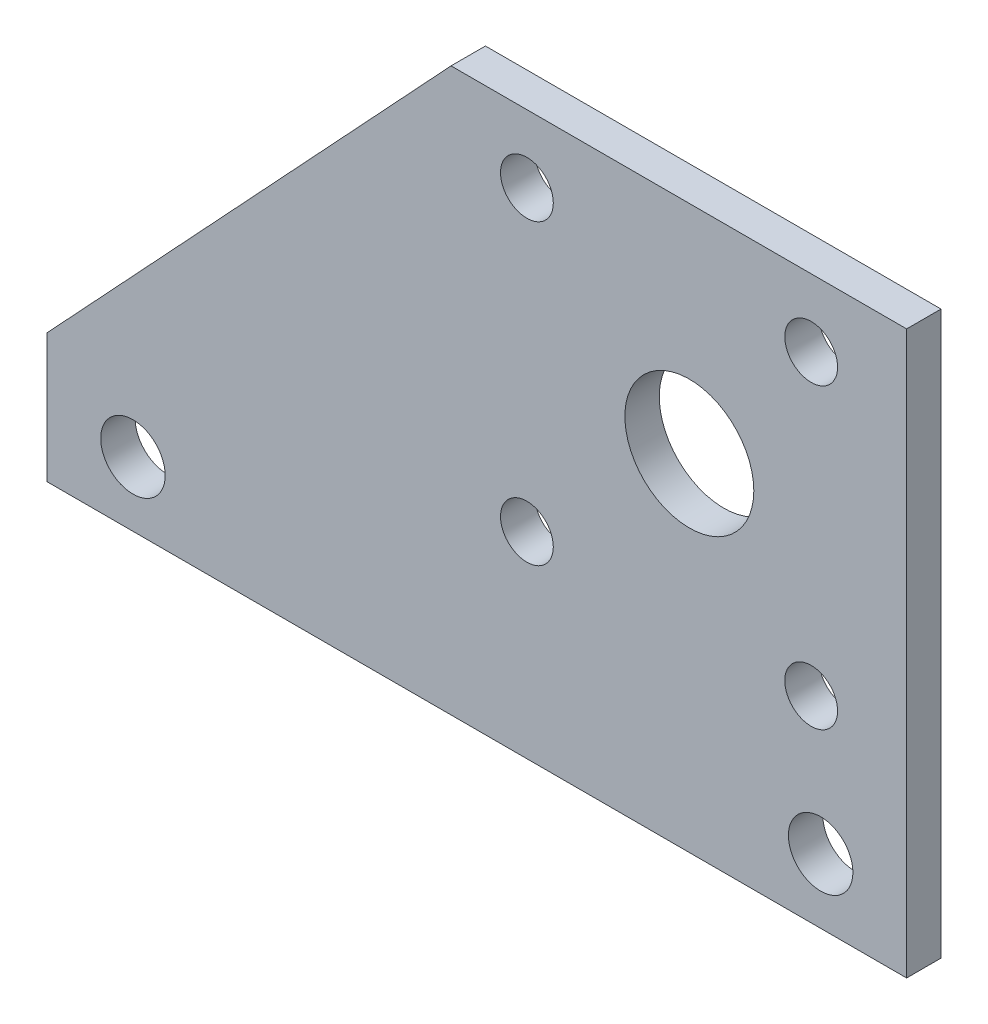
ISO-10303-21;
HEADER;
FILE_DESCRIPTION(('STEP AP214'),'2;1');
FILE_NAME('part.step','',(''),(''),'','','');
FILE_SCHEMA(('AUTOMOTIVE_DESIGN { 1 0 10303 214 1 1 1 1 }'));
ENDSEC;
DATA;
#1=APPLICATION_CONTEXT('core data for automotive mechanical design processes');
#2=APPLICATION_PROTOCOL_DEFINITION('international standard','automotive_design',2000,#1);
#3=PRODUCT_CONTEXT('',#1,'mechanical');
#4=PRODUCT('Part','Part','',(#3));
#5=PRODUCT_RELATED_PRODUCT_CATEGORY('part','',(#4));
#6=PRODUCT_DEFINITION_FORMATION('','',#4);
#7=PRODUCT_DEFINITION_CONTEXT('part definition',#1,'design');
#8=PRODUCT_DEFINITION('design','',#6,#7);
#9=PRODUCT_DEFINITION_SHAPE('','',#8);
#10=(LENGTH_UNIT() NAMED_UNIT(*) SI_UNIT(.MILLI.,.METRE.));
#11=(NAMED_UNIT(*) PLANE_ANGLE_UNIT() SI_UNIT($,.RADIAN.));
#12=(NAMED_UNIT(*) SI_UNIT($,.STERADIAN.) SOLID_ANGLE_UNIT());
#13=UNCERTAINTY_MEASURE_WITH_UNIT(LENGTH_MEASURE(1.E-05),#10,'distance_accuracy_value','');
#14=(GEOMETRIC_REPRESENTATION_CONTEXT(3) GLOBAL_UNCERTAINTY_ASSIGNED_CONTEXT((#13)) GLOBAL_UNIT_ASSIGNED_CONTEXT((#10,
#11,#12)) REPRESENTATION_CONTEXT('',''));
#15=CARTESIAN_POINT('',(0.,0.,0.));
#16=DIRECTION('',(0.,0.,1.));
#17=DIRECTION('',(1.,0.,0.));
#18=AXIS2_PLACEMENT_3D('',#15,#16,#17);
#19=CARTESIAN_POINT('',(0.,0.,2.54));
#20=DIRECTION('',(0.,0.,-1.));
#21=DIRECTION('',(-1.,0.,0.));
#22=AXIS2_PLACEMENT_3D('',#19,#20,#21);
#23=PLANE('',#22);
#24=CARTESIAN_POINT('',(41.1000000000004,25.525,2.54));
#25=DIRECTION('',(0.,0.,1.));
#26=DIRECTION('',(1.,0.,0.));
#27=AXIS2_PLACEMENT_3D('',#24,#25,#26);
#28=CIRCLE('',#27,4.7625);
#29=CARTESIAN_POINT('',(45.8625000000004,25.525,2.54));
#30=VERTEX_POINT('',#29);
#31=EDGE_CURVE('E341',#30,#30,#28,.T.);
#32=ORIENTED_EDGE('',*,*,#31,.F.);
#33=EDGE_LOOP('',(#32));
#34=FACE_BOUND('',#33,.T.);
#35=CARTESIAN_POINT('',(29.1000000000004,36.525,2.54));
#36=DIRECTION('',(0.,0.,1.));
#37=DIRECTION('',(1.,0.,0.));
#38=AXIS2_PLACEMENT_3D('',#35,#36,#37);
#39=CIRCLE('',#38,1.95);
#40=CARTESIAN_POINT('',(31.0500000000004,36.525,2.54));
#41=VERTEX_POINT('',#40);
#42=EDGE_CURVE('E343',#41,#41,#39,.T.);
#43=ORIENTED_EDGE('',*,*,#42,.F.);
#44=EDGE_LOOP('',(#43));
#45=FACE_BOUND('',#44,.T.);
#46=CARTESIAN_POINT('',(50.1000000000004,36.525,2.54));
#47=DIRECTION('',(0.,0.,1.));
#48=DIRECTION('',(1.,0.,0.));
#49=AXIS2_PLACEMENT_3D('',#46,#47,#48);
#50=CIRCLE('',#49,1.95);
#51=CARTESIAN_POINT('',(52.0500000000004,36.525,2.54));
#52=VERTEX_POINT('',#51);
#53=EDGE_CURVE('E351',#52,#52,#50,.T.);
#54=ORIENTED_EDGE('',*,*,#53,.F.);
#55=EDGE_LOOP('',(#54));
#56=FACE_BOUND('',#55,.T.);
#57=CARTESIAN_POINT('',(50.8,4.7625,2.54));
#58=DIRECTION('',(0.,0.,1.));
#59=DIRECTION('',(1.,0.,0.));
#60=AXIS2_PLACEMENT_3D('',#57,#58,#59);
#61=CIRCLE('',#60,2.38125);
#62=CARTESIAN_POINT('',(53.18125,4.7625,2.54));
#63=VERTEX_POINT('',#62);
#64=EDGE_CURVE('E180',#63,#63,#61,.T.);
#65=ORIENTED_EDGE('',*,*,#64,.F.);
#66=EDGE_LOOP('',(#65));
#67=FACE_BOUND('',#66,.T.);
#68=DIRECTION('',(0.,1.,0.));
#69=VECTOR('',#68,1.);
#70=CARTESIAN_POINT('',(-6.35000000000005,0.,2.54));
#71=LINE('',#70,#69);
#72=CARTESIAN_POINT('',(-6.35000000000005,0.,2.54));
#73=VERTEX_POINT('',#72);
#74=CARTESIAN_POINT('',(-6.35000000000005,9.525,2.54));
#75=VERTEX_POINT('',#74);
#76=EDGE_CURVE('E155',#73,#75,#71,.T.);
#77=ORIENTED_EDGE('',*,*,#76,.F.);
#78=DIRECTION('',(-1.,0.,0.));
#79=VECTOR('',#78,1.);
#80=CARTESIAN_POINT('',(57.15,0.,2.54));
#81=LINE('',#80,#79);
#82=CARTESIAN_POINT('',(57.15,0.,2.54));
#83=VERTEX_POINT('',#82);
#84=EDGE_CURVE('E99',#83,#73,#81,.T.);
#85=ORIENTED_EDGE('',*,*,#84,.F.);
#86=DIRECTION('',(0.,-1.,0.));
#87=VECTOR('',#86,1.);
#88=CARTESIAN_POINT('',(57.15,41.525,2.54));
#89=LINE('',#88,#87);
#90=CARTESIAN_POINT('',(57.15,41.525,2.54));
#91=VERTEX_POINT('',#90);
#92=EDGE_CURVE('E137',#91,#83,#89,.T.);
#93=ORIENTED_EDGE('',*,*,#92,.F.);
#94=DIRECTION('',(1.,0.,0.));
#95=VECTOR('',#94,1.);
#96=CARTESIAN_POINT('',(23.4960820048748,41.525,2.54));
#97=LINE('',#96,#95);
#98=CARTESIAN_POINT('',(23.4960820048748,41.525,2.54));
#99=VERTEX_POINT('',#98);
#100=EDGE_CURVE('E150',#99,#91,#97,.T.);
#101=ORIENTED_EDGE('',*,*,#100,.F.);
#102=DIRECTION('',(0.682066799321618,0.731289874990187,0.));
#103=VECTOR('',#102,1.);
#104=CARTESIAN_POINT('',(-6.35000000000005,9.525,2.54));
#105=LINE('',#104,#103);
#106=EDGE_CURVE('E153',#75,#99,#105,.T.);
#107=ORIENTED_EDGE('',*,*,#106,.F.);
#108=EDGE_LOOP('',(#77,#85,#93,#101,#107));
#109=FACE_BOUND('',#108,.T.);
#110=CARTESIAN_POINT('',(0.,4.76249999999998,2.54));
#111=DIRECTION('',(0.,0.,1.));
#112=DIRECTION('',(1.,0.,0.));
#113=AXIS2_PLACEMENT_3D('',#110,#111,#112);
#114=CIRCLE('',#113,2.38125);
#115=CARTESIAN_POINT('',(2.38125000000003,4.76249999999998,2.54));
#116=VERTEX_POINT('',#115);
#117=EDGE_CURVE('E164',#116,#116,#114,.T.);
#118=ORIENTED_EDGE('',*,*,#117,.F.);
#119=EDGE_LOOP('',(#118));
#120=FACE_BOUND('',#119,.T.);
#121=CARTESIAN_POINT('',(29.1000000000004,14.525,2.54));
#122=DIRECTION('',(0.,0.,1.));
#123=DIRECTION('',(1.,0.,0.));
#124=AXIS2_PLACEMENT_3D('',#121,#122,#123);
#125=CIRCLE('',#124,1.95);
#126=CARTESIAN_POINT('',(31.0500000000004,14.525,2.54));
#127=VERTEX_POINT('',#126);
#128=EDGE_CURVE('E176',#127,#127,#125,.T.);
#129=ORIENTED_EDGE('',*,*,#128,.F.);
#130=EDGE_LOOP('',(#129));
#131=FACE_BOUND('',#130,.T.);
#132=CARTESIAN_POINT('',(50.1000000000004,14.525,2.54));
#133=DIRECTION('',(0.,0.,1.));
#134=DIRECTION('',(1.,0.,0.));
#135=AXIS2_PLACEMENT_3D('',#132,#133,#134);
#136=CIRCLE('',#135,1.95);
#137=CARTESIAN_POINT('',(52.0500000000004,14.525,2.54));
#138=VERTEX_POINT('',#137);
#139=EDGE_CURVE('E187',#138,#138,#136,.T.);
#140=ORIENTED_EDGE('',*,*,#139,.F.);
#141=EDGE_LOOP('',(#140));
#142=FACE_BOUND('',#141,.T.);
#143=ADVANCED_FACE('F81',(#34,#45,#56,#67,#109,#120,#131,#142),#23,.F.);
#144=CARTESIAN_POINT('',(0.,0.,0.));
#145=DIRECTION('',(0.,0.,-1.));
#146=DIRECTION('',(-1.,0.,0.));
#147=AXIS2_PLACEMENT_3D('',#144,#145,#146);
#148=PLANE('',#147);
#149=CARTESIAN_POINT('',(41.1000000000004,25.525,0.));
#150=DIRECTION('',(0.,0.,1.));
#151=DIRECTION('',(1.,0.,0.));
#152=AXIS2_PLACEMENT_3D('',#149,#150,#151);
#153=CIRCLE('',#152,4.7625);
#154=CARTESIAN_POINT('',(45.8625000000004,25.525,0.));
#155=VERTEX_POINT('',#154);
#156=EDGE_CURVE('E339',#155,#155,#153,.T.);
#157=ORIENTED_EDGE('',*,*,#156,.T.);
#158=EDGE_LOOP('',(#157));
#159=FACE_BOUND('',#158,.T.);
#160=CARTESIAN_POINT('',(29.1000000000004,36.525,0.));
#161=DIRECTION('',(0.,0.,-1.));
#162=DIRECTION('',(-1.,0.,0.));
#163=AXIS2_PLACEMENT_3D('',#160,#161,#162);
#164=CIRCLE('',#163,1.95);
#165=CARTESIAN_POINT('',(27.1500000000004,36.525,0.));
#166=VERTEX_POINT('',#165);
#167=EDGE_CURVE('E348',#166,#166,#164,.T.);
#168=ORIENTED_EDGE('',*,*,#167,.F.);
#169=EDGE_LOOP('',(#168));
#170=FACE_BOUND('',#169,.T.);
#171=CARTESIAN_POINT('',(50.1000000000004,36.525,0.));
#172=DIRECTION('',(0.,0.,-1.));
#173=DIRECTION('',(-1.,0.,0.));
#174=AXIS2_PLACEMENT_3D('',#171,#172,#173);
#175=CIRCLE('',#174,1.95);
#176=CARTESIAN_POINT('',(48.1500000000004,36.525,0.));
#177=VERTEX_POINT('',#176);
#178=EDGE_CURVE('E353',#177,#177,#175,.T.);
#179=ORIENTED_EDGE('',*,*,#178,.F.);
#180=EDGE_LOOP('',(#179));
#181=FACE_BOUND('',#180,.T.);
#182=CARTESIAN_POINT('',(50.1000000000004,14.525,0.));
#183=DIRECTION('',(0.,0.,-1.));
#184=DIRECTION('',(-1.,0.,0.));
#185=AXIS2_PLACEMENT_3D('',#182,#183,#184);
#186=CIRCLE('',#185,1.95);
#187=CARTESIAN_POINT('',(48.1500000000004,14.525,0.));
#188=VERTEX_POINT('',#187);
#189=EDGE_CURVE('E85',#188,#188,#186,.T.);
#190=ORIENTED_EDGE('',*,*,#189,.F.);
#191=EDGE_LOOP('',(#190));
#192=FACE_BOUND('',#191,.T.);
#193=CARTESIAN_POINT('',(29.1000000000004,14.525,0.));
#194=DIRECTION('',(0.,0.,-1.));
#195=DIRECTION('',(-1.,0.,0.));
#196=AXIS2_PLACEMENT_3D('',#193,#194,#195);
#197=CIRCLE('',#196,1.95);
#198=CARTESIAN_POINT('',(27.1500000000004,14.525,0.));
#199=VERTEX_POINT('',#198);
#200=EDGE_CURVE('E173',#199,#199,#197,.T.);
#201=ORIENTED_EDGE('',*,*,#200,.F.);
#202=EDGE_LOOP('',(#201));
#203=FACE_BOUND('',#202,.T.);
#204=CARTESIAN_POINT('',(0.,4.76249999999998,0.));
#205=DIRECTION('',(0.,0.,1.));
#206=DIRECTION('',(1.,0.,0.));
#207=AXIS2_PLACEMENT_3D('',#204,#205,#206);
#208=CIRCLE('',#207,2.38125);
#209=CARTESIAN_POINT('',(2.38125000000003,4.76249999999998,0.));
#210=VERTEX_POINT('',#209);
#211=EDGE_CURVE('E192',#210,#210,#208,.T.);
#212=ORIENTED_EDGE('',*,*,#211,.T.);
#213=EDGE_LOOP('',(#212));
#214=FACE_BOUND('',#213,.T.);
#215=DIRECTION('',(0.,1.,0.));
#216=VECTOR('',#215,1.);
#217=CARTESIAN_POINT('',(-6.35000000000005,0.,0.));
#218=LINE('',#217,#216);
#219=CARTESIAN_POINT('',(-6.35000000000005,0.,0.));
#220=VERTEX_POINT('',#219);
#221=CARTESIAN_POINT('',(-6.35000000000005,9.525,0.));
#222=VERTEX_POINT('',#221);
#223=EDGE_CURVE('E160',#220,#222,#218,.T.);
#224=ORIENTED_EDGE('',*,*,#223,.T.);
#225=DIRECTION('',(0.682066799321618,0.731289874990187,0.));
#226=VECTOR('',#225,1.);
#227=CARTESIAN_POINT('',(-6.35000000000005,9.525,0.));
#228=LINE('',#227,#226);
#229=CARTESIAN_POINT('',(23.4960820048748,41.525,0.));
#230=VERTEX_POINT('',#229);
#231=EDGE_CURVE('E163',#222,#230,#228,.T.);
#232=ORIENTED_EDGE('',*,*,#231,.T.);
#233=DIRECTION('',(1.,0.,0.));
#234=VECTOR('',#233,1.);
#235=CARTESIAN_POINT('',(23.4960820048748,41.525,0.));
#236=LINE('',#235,#234);
#237=CARTESIAN_POINT('',(57.15,41.525,0.));
#238=VERTEX_POINT('',#237);
#239=EDGE_CURVE('E167',#230,#238,#236,.T.);
#240=ORIENTED_EDGE('',*,*,#239,.T.);
#241=DIRECTION('',(0.,-1.,0.));
#242=VECTOR('',#241,1.);
#243=CARTESIAN_POINT('',(57.15,41.525,0.));
#244=LINE('',#243,#242);
#245=CARTESIAN_POINT('',(57.15,0.,0.));
#246=VERTEX_POINT('',#245);
#247=EDGE_CURVE('E139',#238,#246,#244,.T.);
#248=ORIENTED_EDGE('',*,*,#247,.T.);
#249=DIRECTION('',(-1.,0.,0.));
#250=VECTOR('',#249,1.);
#251=CARTESIAN_POINT('',(6.34999999999995,0.,0.));
#252=LINE('',#251,#250);
#253=EDGE_CURVE('E116',#246,#220,#252,.T.);
#254=ORIENTED_EDGE('',*,*,#253,.T.);
#255=EDGE_LOOP('',(#224,#232,#240,#248,#254));
#256=FACE_BOUND('',#255,.T.);
#257=CARTESIAN_POINT('',(50.8,4.7625,0.));
#258=DIRECTION('',(0.,0.,1.));
#259=DIRECTION('',(1.,0.,0.));
#260=AXIS2_PLACEMENT_3D('',#257,#258,#259);
#261=CIRCLE('',#260,2.38125);
#262=CARTESIAN_POINT('',(53.18125,4.7625,0.));
#263=VERTEX_POINT('',#262);
#264=EDGE_CURVE('E175',#263,#263,#261,.T.);
#265=ORIENTED_EDGE('',*,*,#264,.T.);
#266=EDGE_LOOP('',(#265));
#267=FACE_BOUND('',#266,.T.);
#268=ADVANCED_FACE('F201',(#159,#170,#181,#192,#203,#214,#256,#267),#148,.T.);
#269=CARTESIAN_POINT('',(-6.35000000000005,0.,2.54));
#270=DIRECTION('',(-1.,0.,0.));
#271=DIRECTION('',(0.,-1.,0.));
#272=AXIS2_PLACEMENT_3D('',#269,#270,#271);
#273=PLANE('',#272);
#274=ORIENTED_EDGE('',*,*,#223,.F.);
#275=DIRECTION('',(0.,0.,-1.));
#276=VECTOR('',#275,1.);
#277=CARTESIAN_POINT('',(-6.35000000000005,0.,2.54));
#278=LINE('',#277,#276);
#279=EDGE_CURVE('E12',#73,#220,#278,.T.);
#280=ORIENTED_EDGE('',*,*,#279,.F.);
#281=ORIENTED_EDGE('',*,*,#76,.T.);
#282=DIRECTION('',(0.,0.,-1.));
#283=VECTOR('',#282,1.);
#284=CARTESIAN_POINT('',(-6.35000000000005,9.525,2.54));
#285=LINE('',#284,#283);
#286=EDGE_CURVE('E126',#75,#222,#285,.T.);
#287=ORIENTED_EDGE('',*,*,#286,.T.);
#288=EDGE_LOOP('',(#274,#280,#281,#287));
#289=FACE_BOUND('',#288,.T.);
#290=ADVANCED_FACE('F83',(#289),#273,.T.);
#291=CARTESIAN_POINT('',(6.34999999999995,0.,2.54));
#292=DIRECTION('',(0.,-1.,0.));
#293=DIRECTION('',(0.,0.,-1.));
#294=AXIS2_PLACEMENT_3D('',#291,#292,#293);
#295=PLANE('',#294);
#296=ORIENTED_EDGE('',*,*,#253,.F.);
#297=DIRECTION('',(0.,0.,-1.));
#298=VECTOR('',#297,1.);
#299=CARTESIAN_POINT('',(57.15,0.,2.54));
#300=LINE('',#299,#298);
#301=EDGE_CURVE('E91',#83,#246,#300,.T.);
#302=ORIENTED_EDGE('',*,*,#301,.F.);
#303=ORIENTED_EDGE('',*,*,#84,.T.);
#304=ORIENTED_EDGE('',*,*,#279,.T.);
#305=EDGE_LOOP('',(#296,#302,#303,#304));
#306=FACE_BOUND('',#305,.T.);
#307=ADVANCED_FACE('F232',(#306),#295,.T.);
#308=CARTESIAN_POINT('',(57.15,41.525,2.54));
#309=DIRECTION('',(1.,0.,0.));
#310=DIRECTION('',(0.,0.,-1.));
#311=AXIS2_PLACEMENT_3D('',#308,#309,#310);
#312=PLANE('',#311);
#313=ORIENTED_EDGE('',*,*,#247,.F.);
#314=DIRECTION('',(0.,0.,-1.));
#315=VECTOR('',#314,1.);
#316=CARTESIAN_POINT('',(57.15,41.525,2.54));
#317=LINE('',#316,#315);
#318=EDGE_CURVE('E134',#91,#238,#317,.T.);
#319=ORIENTED_EDGE('',*,*,#318,.F.);
#320=ORIENTED_EDGE('',*,*,#92,.T.);
#321=ORIENTED_EDGE('',*,*,#301,.T.);
#322=EDGE_LOOP('',(#313,#319,#320,#321));
#323=FACE_BOUND('',#322,.T.);
#324=ADVANCED_FACE('F136',(#323),#312,.T.);
#325=CARTESIAN_POINT('',(23.4960820048748,41.525,2.54));
#326=DIRECTION('',(0.,1.,0.));
#327=DIRECTION('',(0.,0.,1.));
#328=AXIS2_PLACEMENT_3D('',#325,#326,#327);
#329=PLANE('',#328);
#330=ORIENTED_EDGE('',*,*,#239,.F.);
#331=DIRECTION('',(0.,0.,-1.));
#332=VECTOR('',#331,1.);
#333=CARTESIAN_POINT('',(23.4960820048748,41.525,2.54));
#334=LINE('',#333,#332);
#335=EDGE_CURVE('E144',#99,#230,#334,.T.);
#336=ORIENTED_EDGE('',*,*,#335,.F.);
#337=ORIENTED_EDGE('',*,*,#100,.T.);
#338=ORIENTED_EDGE('',*,*,#318,.T.);
#339=EDGE_LOOP('',(#330,#336,#337,#338));
#340=FACE_BOUND('',#339,.T.);
#341=ADVANCED_FACE('F152',(#340),#329,.T.);
#342=CARTESIAN_POINT('',(-6.35000000000005,9.525,2.54));
#343=DIRECTION('',(-0.731289874990187,0.682066799321618,0.));
#344=DIRECTION('',(-0.682066799321618,-0.731289874990187,0.));
#345=AXIS2_PLACEMENT_3D('',#342,#343,#344);
#346=PLANE('',#345);
#347=ORIENTED_EDGE('',*,*,#231,.F.);
#348=ORIENTED_EDGE('',*,*,#286,.F.);
#349=ORIENTED_EDGE('',*,*,#106,.T.);
#350=ORIENTED_EDGE('',*,*,#335,.T.);
#351=EDGE_LOOP('',(#347,#348,#349,#350));
#352=FACE_BOUND('',#351,.T.);
#353=ADVANCED_FACE('F199',(#352),#346,.T.);
#354=CARTESIAN_POINT('',(0.,4.76249999999998,2.54));
#355=DIRECTION('',(0.,0.,-1.));
#356=DIRECTION('',(-1.,0.,0.));
#357=AXIS2_PLACEMENT_3D('',#354,#355,#356);
#358=CYLINDRICAL_SURFACE('',#357,2.38125);
#359=ORIENTED_EDGE('',*,*,#117,.T.);
#360=EDGE_LOOP('',(#359));
#361=FACE_BOUND('',#360,.T.);
#362=ORIENTED_EDGE('',*,*,#211,.F.);
#363=EDGE_LOOP('',(#362));
#364=FACE_BOUND('',#363,.T.);
#365=ADVANCED_FACE('F211',(#361,#364),#358,.F.);
#366=CARTESIAN_POINT('',(50.8,4.7625,2.54));
#367=DIRECTION('',(0.,0.,-1.));
#368=DIRECTION('',(-1.,0.,0.));
#369=AXIS2_PLACEMENT_3D('',#366,#367,#368);
#370=CYLINDRICAL_SURFACE('',#369,2.38125);
#371=ORIENTED_EDGE('',*,*,#64,.T.);
#372=EDGE_LOOP('',(#371));
#373=FACE_BOUND('',#372,.T.);
#374=ORIENTED_EDGE('',*,*,#264,.F.);
#375=EDGE_LOOP('',(#374));
#376=FACE_BOUND('',#375,.T.);
#377=ADVANCED_FACE('F208',(#373,#376),#370,.F.);
#378=CARTESIAN_POINT('',(29.1000000000004,14.525,2.54));
#379=DIRECTION('',(0.,0.,1.));
#380=DIRECTION('',(1.,0.,0.));
#381=AXIS2_PLACEMENT_3D('',#378,#379,#380);
#382=CYLINDRICAL_SURFACE('',#381,1.95);
#383=ORIENTED_EDGE('',*,*,#200,.T.);
#384=EDGE_LOOP('',(#383));
#385=FACE_BOUND('',#384,.T.);
#386=ORIENTED_EDGE('',*,*,#128,.T.);
#387=EDGE_LOOP('',(#386));
#388=FACE_BOUND('',#387,.T.);
#389=ADVANCED_FACE('F210',(#385,#388),#382,.F.);
#390=CARTESIAN_POINT('',(50.1000000000004,14.525,2.54));
#391=DIRECTION('',(0.,0.,1.));
#392=DIRECTION('',(1.,0.,0.));
#393=AXIS2_PLACEMENT_3D('',#390,#391,#392);
#394=CYLINDRICAL_SURFACE('',#393,1.95);
#395=ORIENTED_EDGE('',*,*,#189,.T.);
#396=EDGE_LOOP('',(#395));
#397=FACE_BOUND('',#396,.T.);
#398=ORIENTED_EDGE('',*,*,#139,.T.);
#399=EDGE_LOOP('',(#398));
#400=FACE_BOUND('',#399,.T.);
#401=ADVANCED_FACE('F219',(#397,#400),#394,.F.);
#402=CARTESIAN_POINT('',(50.1000000000004,36.525,2.54));
#403=DIRECTION('',(0.,0.,1.));
#404=DIRECTION('',(1.,0.,0.));
#405=AXIS2_PLACEMENT_3D('',#402,#403,#404);
#406=CYLINDRICAL_SURFACE('',#405,1.95);
#407=ORIENTED_EDGE('',*,*,#178,.T.);
#408=EDGE_LOOP('',(#407));
#409=FACE_BOUND('',#408,.T.);
#410=ORIENTED_EDGE('',*,*,#53,.T.);
#411=EDGE_LOOP('',(#410));
#412=FACE_BOUND('',#411,.T.);
#413=ADVANCED_FACE('F266',(#409,#412),#406,.F.);
#414=CARTESIAN_POINT('',(29.1000000000004,36.525,2.54));
#415=DIRECTION('',(0.,0.,1.));
#416=DIRECTION('',(1.,0.,0.));
#417=AXIS2_PLACEMENT_3D('',#414,#415,#416);
#418=CYLINDRICAL_SURFACE('',#417,1.95);
#419=ORIENTED_EDGE('',*,*,#167,.T.);
#420=EDGE_LOOP('',(#419));
#421=FACE_BOUND('',#420,.T.);
#422=ORIENTED_EDGE('',*,*,#42,.T.);
#423=EDGE_LOOP('',(#422));
#424=FACE_BOUND('',#423,.T.);
#425=ADVANCED_FACE('F275',(#421,#424),#418,.F.);
#426=CARTESIAN_POINT('',(41.1000000000004,25.525,0.));
#427=DIRECTION('',(0.,0.,1.));
#428=DIRECTION('',(1.,0.,0.));
#429=AXIS2_PLACEMENT_3D('',#426,#427,#428);
#430=CYLINDRICAL_SURFACE('',#429,4.7625);
#431=ORIENTED_EDGE('',*,*,#156,.F.);
#432=EDGE_LOOP('',(#431));
#433=FACE_BOUND('',#432,.T.);
#434=ORIENTED_EDGE('',*,*,#31,.T.);
#435=EDGE_LOOP('',(#434));
#436=FACE_BOUND('',#435,.T.);
#437=ADVANCED_FACE('F284',(#433,#436),#430,.F.);
#438=CLOSED_SHELL('',(#143,#268,#290,#307,#324,#341,#353,#365,#377,#389,#401,#413,#425,#437));
#439=MANIFOLD_SOLID_BREP('B2',#438);
#440=ADVANCED_BREP_SHAPE_REPRESENTATION('',(#18,#439),#14);
#441=SHAPE_DEFINITION_REPRESENTATION(#9,#440);
ENDSEC;
END-ISO-10303-21;
